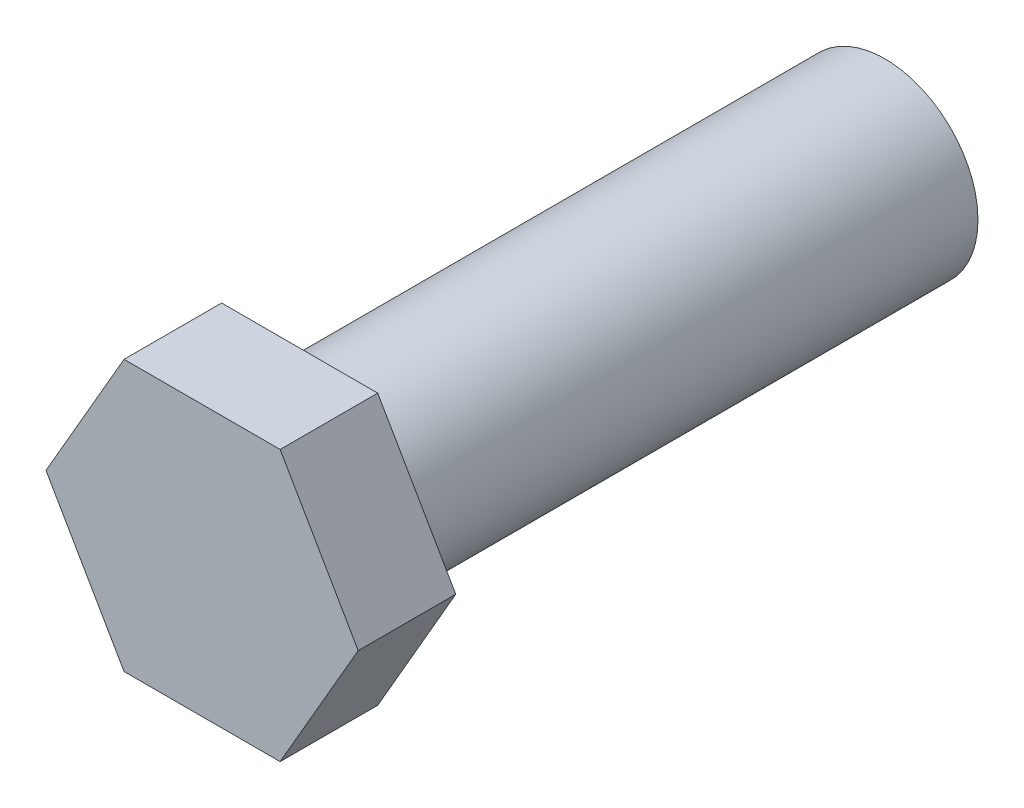
ISO-10303-21;
HEADER;
FILE_DESCRIPTION(('STEP AP214'),'2;1');
FILE_NAME('part.step','',(''),(''),'','','');
FILE_SCHEMA(('AUTOMOTIVE_DESIGN { 1 0 10303 214 1 1 1 1 }'));
ENDSEC;
DATA;
#1=APPLICATION_CONTEXT('core data for automotive mechanical design processes');
#2=APPLICATION_PROTOCOL_DEFINITION('international standard','automotive_design',2000,#1);
#3=PRODUCT_CONTEXT('',#1,'mechanical');
#4=PRODUCT('Part','Part','',(#3));
#5=PRODUCT_RELATED_PRODUCT_CATEGORY('part','',(#4));
#6=PRODUCT_DEFINITION_FORMATION('','',#4);
#7=PRODUCT_DEFINITION_CONTEXT('part definition',#1,'design');
#8=PRODUCT_DEFINITION('design','',#6,#7);
#9=PRODUCT_DEFINITION_SHAPE('','',#8);
#10=(LENGTH_UNIT() NAMED_UNIT(*) SI_UNIT(.MILLI.,.METRE.));
#11=(NAMED_UNIT(*) PLANE_ANGLE_UNIT() SI_UNIT($,.RADIAN.));
#12=(NAMED_UNIT(*) SI_UNIT($,.STERADIAN.) SOLID_ANGLE_UNIT());
#13=UNCERTAINTY_MEASURE_WITH_UNIT(LENGTH_MEASURE(1.E-05),#10,'distance_accuracy_value','');
#14=(GEOMETRIC_REPRESENTATION_CONTEXT(3) GLOBAL_UNCERTAINTY_ASSIGNED_CONTEXT((#13)) GLOBAL_UNIT_ASSIGNED_CONTEXT((#10,
#11,#12)) REPRESENTATION_CONTEXT('',''));
#15=CARTESIAN_POINT('',(0.,0.,0.));
#16=DIRECTION('',(0.,0.,1.));
#17=DIRECTION('',(1.,0.,0.));
#18=AXIS2_PLACEMENT_3D('',#15,#16,#17);
#19=CARTESIAN_POINT('',(8.,0.,0.));
#20=DIRECTION('',(0.,0.,1.));
#21=DIRECTION('',(1.,0.,0.));
#22=AXIS2_PLACEMENT_3D('',#19,#20,#21);
#23=PLANE('',#22);
#24=DIRECTION('',(0.5,0.866025403784439,0.));
#25=VECTOR('',#24,1.);
#26=CARTESIAN_POINT('',(4.,-6.92820323027551,0.));
#27=LINE('',#26,#25);
#28=CARTESIAN_POINT('',(4.,-6.92820323027551,0.));
#29=VERTEX_POINT('',#28);
#30=CARTESIAN_POINT('',(8.,0.,0.));
#31=VERTEX_POINT('',#30);
#32=EDGE_CURVE('E116',#29,#31,#27,.T.);
#33=ORIENTED_EDGE('',*,*,#32,.F.);
#34=DIRECTION('',(1.,0.,0.));
#35=VECTOR('',#34,1.);
#36=CARTESIAN_POINT('',(-4.,-6.92820323027551,0.));
#37=LINE('',#36,#35);
#38=CARTESIAN_POINT('',(-4.,-6.92820323027551,0.));
#39=VERTEX_POINT('',#38);
#40=EDGE_CURVE('E76',#39,#29,#37,.T.);
#41=ORIENTED_EDGE('',*,*,#40,.F.);
#42=DIRECTION('',(0.5,-0.866025403784439,0.));
#43=VECTOR('',#42,1.);
#44=CARTESIAN_POINT('',(-8.,0.,0.));
#45=LINE('',#44,#43);
#46=CARTESIAN_POINT('',(-8.,0.,0.));
#47=VERTEX_POINT('',#46);
#48=EDGE_CURVE('E70',#47,#39,#45,.T.);
#49=ORIENTED_EDGE('',*,*,#48,.F.);
#50=DIRECTION('',(-0.5,-0.866025403784438,0.));
#51=VECTOR('',#50,1.);
#52=CARTESIAN_POINT('',(-4.,6.92820323027551,0.));
#53=LINE('',#52,#51);
#54=CARTESIAN_POINT('',(-4.,6.92820323027551,0.));
#55=VERTEX_POINT('',#54);
#56=EDGE_CURVE('E106',#55,#47,#53,.T.);
#57=ORIENTED_EDGE('',*,*,#56,.F.);
#58=DIRECTION('',(-1.,0.,0.));
#59=VECTOR('',#58,1.);
#60=CARTESIAN_POINT('',(4.,6.92820323027551,0.));
#61=LINE('',#60,#59);
#62=CARTESIAN_POINT('',(4.,6.92820323027551,0.));
#63=VERTEX_POINT('',#62);
#64=EDGE_CURVE('E122',#63,#55,#61,.T.);
#65=ORIENTED_EDGE('',*,*,#64,.F.);
#66=DIRECTION('',(-0.5,0.866025403784439,0.));
#67=VECTOR('',#66,1.);
#68=CARTESIAN_POINT('',(8.,0.,0.));
#69=LINE('',#68,#67);
#70=EDGE_CURVE('E119',#31,#63,#69,.T.);
#71=ORIENTED_EDGE('',*,*,#70,.F.);
#72=EDGE_LOOP('',(#33,#41,#49,#57,#65,#71));
#73=FACE_BOUND('',#72,.T.);
#74=CARTESIAN_POINT('',(0.,0.,0.));
#75=DIRECTION('',(0.,0.,1.));
#76=DIRECTION('',(1.,0.,0.));
#77=AXIS2_PLACEMENT_3D('',#74,#75,#76);
#78=CIRCLE('',#77,4.765);
#79=CARTESIAN_POINT('',(4.765,0.,0.));
#80=VERTEX_POINT('',#79);
#81=EDGE_CURVE('E11',#80,#80,#78,.F.);
#82=ORIENTED_EDGE('',*,*,#81,.F.);
#83=EDGE_LOOP('',(#82));
#84=FACE_BOUND('',#83,.T.);
#85=ADVANCED_FACE('F30',(#73,#84),#23,.F.);
#86=CARTESIAN_POINT('',(4.,-6.92820323027551,5.));
#87=DIRECTION('',(-0.866025403784439,0.5,0.));
#88=DIRECTION('',(-0.5,-0.866025403784439,0.));
#89=AXIS2_PLACEMENT_3D('',#86,#87,#88);
#90=PLANE('',#89);
#91=ORIENTED_EDGE('',*,*,#32,.T.);
#92=DIRECTION('',(0.,0.,-1.));
#93=VECTOR('',#92,1.);
#94=CARTESIAN_POINT('',(8.,0.,5.));
#95=LINE('',#94,#93);
#96=CARTESIAN_POINT('',(8.,0.,5.));
#97=VERTEX_POINT('',#96);
#98=EDGE_CURVE('E39',#97,#31,#95,.T.);
#99=ORIENTED_EDGE('',*,*,#98,.F.);
#100=DIRECTION('',(0.5,0.866025403784439,0.));
#101=VECTOR('',#100,1.);
#102=CARTESIAN_POINT('',(4.,-6.92820323027551,5.));
#103=LINE('',#102,#101);
#104=CARTESIAN_POINT('',(4.,-6.92820323027551,5.));
#105=VERTEX_POINT('',#104);
#106=EDGE_CURVE('E127',#105,#97,#103,.T.);
#107=ORIENTED_EDGE('',*,*,#106,.F.);
#108=DIRECTION('',(0.,0.,-1.));
#109=VECTOR('',#108,1.);
#110=CARTESIAN_POINT('',(4.,-6.92820323027551,5.));
#111=LINE('',#110,#109);
#112=EDGE_CURVE('E112',#105,#29,#111,.T.);
#113=ORIENTED_EDGE('',*,*,#112,.T.);
#114=EDGE_LOOP('',(#91,#99,#107,#113));
#115=FACE_BOUND('',#114,.T.);
#116=ADVANCED_FACE('F32',(#115),#90,.F.);
#117=CARTESIAN_POINT('',(8.,0.,5.));
#118=DIRECTION('',(-0.866025403784439,-0.5,0.));
#119=DIRECTION('',(0.5,-0.866025403784439,0.));
#120=AXIS2_PLACEMENT_3D('',#117,#118,#119);
#121=PLANE('',#120);
#122=ORIENTED_EDGE('',*,*,#70,.T.);
#123=DIRECTION('',(0.,0.,-1.));
#124=VECTOR('',#123,1.);
#125=CARTESIAN_POINT('',(4.,6.92820323027551,5.));
#126=LINE('',#125,#124);
#127=CARTESIAN_POINT('',(4.,6.92820323027551,5.));
#128=VERTEX_POINT('',#127);
#129=EDGE_CURVE('E131',#128,#63,#126,.T.);
#130=ORIENTED_EDGE('',*,*,#129,.F.);
#131=DIRECTION('',(-0.5,0.866025403784439,0.));
#132=VECTOR('',#131,1.);
#133=CARTESIAN_POINT('',(8.,0.,5.));
#134=LINE('',#133,#132);
#135=EDGE_CURVE('E85',#97,#128,#134,.T.);
#136=ORIENTED_EDGE('',*,*,#135,.F.);
#137=ORIENTED_EDGE('',*,*,#98,.T.);
#138=EDGE_LOOP('',(#122,#130,#136,#137));
#139=FACE_BOUND('',#138,.T.);
#140=ADVANCED_FACE('F134',(#139),#121,.F.);
#141=CARTESIAN_POINT('',(4.,6.92820323027551,5.));
#142=DIRECTION('',(0.,-1.,0.));
#143=DIRECTION('',(0.,0.,-1.));
#144=AXIS2_PLACEMENT_3D('',#141,#142,#143);
#145=PLANE('',#144);
#146=ORIENTED_EDGE('',*,*,#64,.T.);
#147=DIRECTION('',(0.,0.,-1.));
#148=VECTOR('',#147,1.);
#149=CARTESIAN_POINT('',(-4.,6.92820323027551,5.));
#150=LINE('',#149,#148);
#151=CARTESIAN_POINT('',(-4.,6.92820323027551,5.));
#152=VERTEX_POINT('',#151);
#153=EDGE_CURVE('E107',#152,#55,#150,.T.);
#154=ORIENTED_EDGE('',*,*,#153,.F.);
#155=DIRECTION('',(-1.,0.,0.));
#156=VECTOR('',#155,1.);
#157=CARTESIAN_POINT('',(4.,6.92820323027551,5.));
#158=LINE('',#157,#156);
#159=EDGE_CURVE('E98',#128,#152,#158,.T.);
#160=ORIENTED_EDGE('',*,*,#159,.F.);
#161=ORIENTED_EDGE('',*,*,#129,.T.);
#162=EDGE_LOOP('',(#146,#154,#160,#161));
#163=FACE_BOUND('',#162,.T.);
#164=ADVANCED_FACE('F142',(#163),#145,.F.);
#165=CARTESIAN_POINT('',(-4.,6.92820323027551,5.));
#166=DIRECTION('',(0.866025403784438,-0.5,0.));
#167=DIRECTION('',(0.5,0.866025403784439,0.));
#168=AXIS2_PLACEMENT_3D('',#165,#166,#167);
#169=PLANE('',#168);
#170=ORIENTED_EDGE('',*,*,#56,.T.);
#171=DIRECTION('',(0.,0.,-1.));
#172=VECTOR('',#171,1.);
#173=CARTESIAN_POINT('',(-8.,0.,5.));
#174=LINE('',#173,#172);
#175=CARTESIAN_POINT('',(-8.,0.,5.));
#176=VERTEX_POINT('',#175);
#177=EDGE_CURVE('E103',#176,#47,#174,.T.);
#178=ORIENTED_EDGE('',*,*,#177,.F.);
#179=DIRECTION('',(-0.5,-0.866025403784438,0.));
#180=VECTOR('',#179,1.);
#181=CARTESIAN_POINT('',(-4.,6.92820323027551,5.));
#182=LINE('',#181,#180);
#183=EDGE_CURVE('E92',#152,#176,#182,.T.);
#184=ORIENTED_EDGE('',*,*,#183,.F.);
#185=ORIENTED_EDGE('',*,*,#153,.T.);
#186=EDGE_LOOP('',(#170,#178,#184,#185));
#187=FACE_BOUND('',#186,.T.);
#188=ADVANCED_FACE('F104',(#187),#169,.F.);
#189=CARTESIAN_POINT('',(-8.,0.,5.));
#190=DIRECTION('',(0.866025403784439,0.5,0.));
#191=DIRECTION('',(-0.5,0.866025403784439,0.));
#192=AXIS2_PLACEMENT_3D('',#189,#190,#191);
#193=PLANE('',#192);
#194=ORIENTED_EDGE('',*,*,#48,.T.);
#195=DIRECTION('',(0.,0.,-1.));
#196=VECTOR('',#195,1.);
#197=CARTESIAN_POINT('',(-4.,-6.92820323027551,5.));
#198=LINE('',#197,#196);
#199=CARTESIAN_POINT('',(-4.,-6.92820323027551,5.));
#200=VERTEX_POINT('',#199);
#201=EDGE_CURVE('E108',#200,#39,#198,.T.);
#202=ORIENTED_EDGE('',*,*,#201,.F.);
#203=DIRECTION('',(0.5,-0.866025403784439,0.));
#204=VECTOR('',#203,1.);
#205=CARTESIAN_POINT('',(-8.,0.,5.));
#206=LINE('',#205,#204);
#207=EDGE_CURVE('E96',#176,#200,#206,.T.);
#208=ORIENTED_EDGE('',*,*,#207,.F.);
#209=ORIENTED_EDGE('',*,*,#177,.T.);
#210=EDGE_LOOP('',(#194,#202,#208,#209));
#211=FACE_BOUND('',#210,.T.);
#212=ADVANCED_FACE('F110',(#211),#193,.F.);
#213=CARTESIAN_POINT('',(-4.,-6.92820323027551,5.));
#214=DIRECTION('',(0.,1.,0.));
#215=DIRECTION('',(0.,0.,1.));
#216=AXIS2_PLACEMENT_3D('',#213,#214,#215);
#217=PLANE('',#216);
#218=ORIENTED_EDGE('',*,*,#40,.T.);
#219=ORIENTED_EDGE('',*,*,#112,.F.);
#220=DIRECTION('',(1.,0.,0.));
#221=VECTOR('',#220,1.);
#222=CARTESIAN_POINT('',(-4.,-6.92820323027551,5.));
#223=LINE('',#222,#221);
#224=EDGE_CURVE('E47',#200,#105,#223,.T.);
#225=ORIENTED_EDGE('',*,*,#224,.F.);
#226=ORIENTED_EDGE('',*,*,#201,.T.);
#227=EDGE_LOOP('',(#218,#219,#225,#226));
#228=FACE_BOUND('',#227,.T.);
#229=ADVANCED_FACE('F163',(#228),#217,.F.);
#230=CARTESIAN_POINT('',(8.,0.,5.));
#231=DIRECTION('',(0.,0.,1.));
#232=DIRECTION('',(1.,0.,0.));
#233=AXIS2_PLACEMENT_3D('',#230,#231,#232);
#234=PLANE('',#233);
#235=ORIENTED_EDGE('',*,*,#106,.T.);
#236=ORIENTED_EDGE('',*,*,#135,.T.);
#237=ORIENTED_EDGE('',*,*,#159,.T.);
#238=ORIENTED_EDGE('',*,*,#183,.T.);
#239=ORIENTED_EDGE('',*,*,#207,.T.);
#240=ORIENTED_EDGE('',*,*,#224,.T.);
#241=EDGE_LOOP('',(#235,#236,#237,#238,#239,#240));
#242=FACE_BOUND('',#241,.T.);
#243=ADVANCED_FACE('F94',(#242),#234,.T.);
#244=CARTESIAN_POINT('',(0.,0.,-30.));
#245=DIRECTION('',(0.,0.,1.));
#246=DIRECTION('',(1.,0.,0.));
#247=AXIS2_PLACEMENT_3D('',#244,#245,#246);
#248=CYLINDRICAL_SURFACE('',#247,4.765);
#249=CARTESIAN_POINT('',(0.,0.,-30.));
#250=DIRECTION('',(0.,0.,-1.));
#251=DIRECTION('',(-1.,0.,0.));
#252=AXIS2_PLACEMENT_3D('',#249,#250,#251);
#253=CIRCLE('',#252,4.765);
#254=CARTESIAN_POINT('',(-4.765,0.,-30.));
#255=VERTEX_POINT('',#254);
#256=EDGE_CURVE('E120',#255,#255,#253,.T.);
#257=ORIENTED_EDGE('',*,*,#256,.F.);
#258=EDGE_LOOP('',(#257));
#259=FACE_BOUND('',#258,.T.);
#260=ORIENTED_EDGE('',*,*,#81,.T.);
#261=EDGE_LOOP('',(#260));
#262=FACE_BOUND('',#261,.T.);
#263=ADVANCED_FACE('F151',(#259,#262),#248,.T.);
#264=CARTESIAN_POINT('',(0.,0.,-30.));
#265=DIRECTION('',(0.,0.,-1.));
#266=DIRECTION('',(-1.,0.,0.));
#267=AXIS2_PLACEMENT_3D('',#264,#265,#266);
#268=PLANE('',#267);
#269=ORIENTED_EDGE('',*,*,#256,.T.);
#270=EDGE_LOOP('',(#269));
#271=FACE_BOUND('',#270,.T.);
#272=ADVANCED_FACE('F149',(#271),#268,.T.);
#273=CLOSED_SHELL('',(#85,#116,#140,#164,#188,#212,#229,#243,#263,#272));
#274=MANIFOLD_SOLID_BREP('B2',#273);
#275=ADVANCED_BREP_SHAPE_REPRESENTATION('',(#18,#274),#14);
#276=SHAPE_DEFINITION_REPRESENTATION(#9,#275);
ENDSEC;
END-ISO-10303-21;
